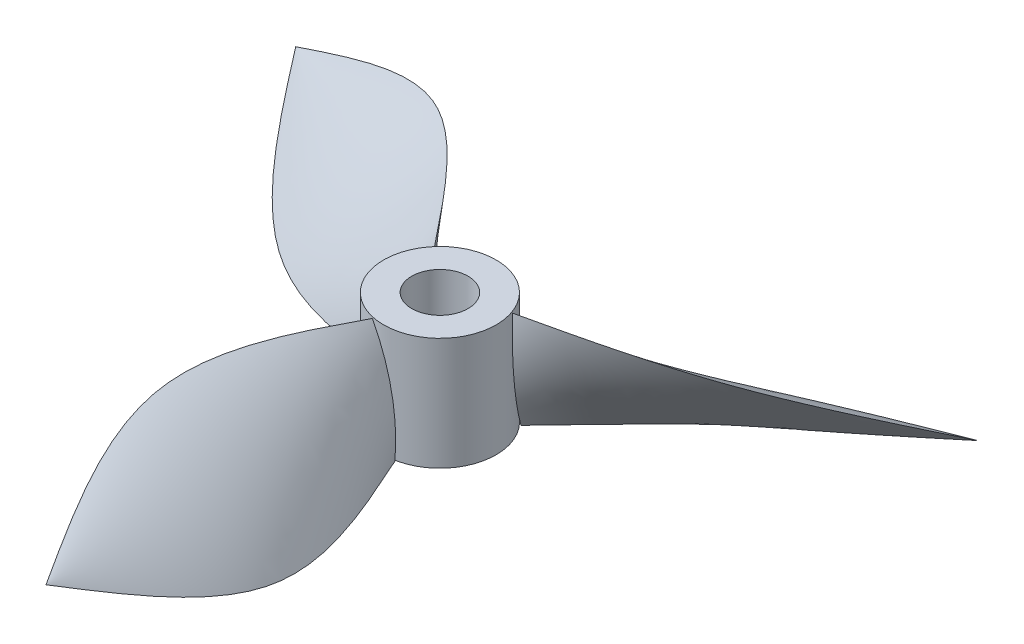
ISO-10303-21;
HEADER;
FILE_DESCRIPTION(('STEP AP214'),'2;1');
FILE_NAME('part.step','',(''),(''),'','','');
FILE_SCHEMA(('AUTOMOTIVE_DESIGN { 1 0 10303 214 1 1 1 1 }'));
ENDSEC;
DATA;
#1=APPLICATION_CONTEXT('core data for automotive mechanical design processes');
#2=APPLICATION_PROTOCOL_DEFINITION('international standard','automotive_design',2000,#1);
#3=PRODUCT_CONTEXT('',#1,'mechanical');
#4=PRODUCT('Part','Part','',(#3));
#5=PRODUCT_RELATED_PRODUCT_CATEGORY('part','',(#4));
#6=PRODUCT_DEFINITION_FORMATION('','',#4);
#7=PRODUCT_DEFINITION_CONTEXT('part definition',#1,'design');
#8=PRODUCT_DEFINITION('design','',#6,#7);
#9=PRODUCT_DEFINITION_SHAPE('','',#8);
#10=(LENGTH_UNIT() NAMED_UNIT(*) SI_UNIT(.MILLI.,.METRE.));
#11=(NAMED_UNIT(*) PLANE_ANGLE_UNIT() SI_UNIT($,.RADIAN.));
#12=(NAMED_UNIT(*) SI_UNIT($,.STERADIAN.) SOLID_ANGLE_UNIT());
#13=UNCERTAINTY_MEASURE_WITH_UNIT(LENGTH_MEASURE(1.E-05),#10,'distance_accuracy_value','');
#14=(GEOMETRIC_REPRESENTATION_CONTEXT(3) GLOBAL_UNCERTAINTY_ASSIGNED_CONTEXT((#13)) GLOBAL_UNIT_ASSIGNED_CONTEXT((#10,
#11,#12)) REPRESENTATION_CONTEXT('',''));
#15=CARTESIAN_POINT('',(0.,0.,0.));
#16=DIRECTION('',(0.,0.,1.));
#17=DIRECTION('',(1.,0.,0.));
#18=AXIS2_PLACEMENT_3D('',#15,#16,#17);
#19=CARTESIAN_POINT('',(8.66025403784443,10.,-4.99999999999992));
#20=DIRECTION('',(-0.866025403784443,0.,0.499999999999992));
#21=DIRECTION('',(0.499999999999992,0.,0.866025403784443));
#22=AXIS2_PLACEMENT_3D('',#19,#20,#21);
#23=PLANE('',#22);
#24=CARTESIAN_POINT('',(7.66025403784445,0.,-6.7320508075688));
#25=CARTESIAN_POINT('',(7.34575721988956,6.91296700891519,-7.27677527508542));
#26=CARTESIAN_POINT('',(8.04053255032547,13.8607203132744,-6.07338910292496));
#27=CARTESIAN_POINT('',(9.66025403784442,20.,-3.26794919243104));
#28=B_SPLINE_CURVE_WITH_KNOTS('',3,(#24,#25,#26,#27),.UNSPECIFIED.,.F.,.F.,(4,4),(0.,1.),.UNSPECIFIED.);
#29=CARTESIAN_POINT('',(7.66025403784445,0.,-6.7320508075688));
#30=VERTEX_POINT('',#29);
#31=CARTESIAN_POINT('',(9.66025403784442,20.,-3.26794919243104));
#32=VERTEX_POINT('',#31);
#33=EDGE_CURVE('E12',#30,#32,#28,.T.);
#34=ORIENTED_EDGE('',*,*,#33,.F.);
#35=CARTESIAN_POINT('',(9.66025403784442,20.,-3.26794919243104));
#36=CARTESIAN_POINT('',(9.97475085579931,13.0870329910848,-2.72322472491442));
#37=CARTESIAN_POINT('',(9.2799755253634,6.13927968672565,-3.92661089707488));
#38=CARTESIAN_POINT('',(7.66025403784445,0.,-6.7320508075688));
#39=B_SPLINE_CURVE_WITH_KNOTS('',3,(#35,#36,#37,#38),.UNSPECIFIED.,.F.,.F.,(4,4),(0.,1.),.UNSPECIFIED.);
#40=EDGE_CURVE('E58',#32,#30,#39,.T.);
#41=ORIENTED_EDGE('',*,*,#40,.F.);
#42=EDGE_LOOP('',(#34,#41));
#43=FACE_BOUND('',#42,.T.);
#44=ADVANCED_FACE('F47',(#43),#23,.T.);
#45=CARTESIAN_POINT('',(7.66025403784445,0.,-6.7320508075688));
#46=CARTESIAN_POINT('',(14.336856526246,-0.790885049230823,-15.3356509891776));
#47=CARTESIAN_POINT('',(27.9261753499969,-2.40062429993598,-32.8471122605457));
#48=CARTESIAN_POINT('',(49.5977298419084,5.81885420147433,-34.2741061007253));
#49=CARTESIAN_POINT('',(60.621778264911,10.,-34.9999999999994));
#50=CARTESIAN_POINT('',(7.34575721988956,6.91296700891519,-7.27677527508542));
#51=CARTESIAN_POINT('',(15.3263328322946,7.37562624414803,-13.6218277542158));
#52=CARTESIAN_POINT('',(31.5697120932917,8.31730636742238,-26.5363215019148));
#53=CARTESIAN_POINT('',(50.8262291478732,9.4326424830003,-32.1462828857311));
#54=CARTESIAN_POINT('',(60.621778264911,10.,-34.9999999999994));
#55=CARTESIAN_POINT('',(8.04053255032547,13.8607203132744,-6.07338910292496));
#56=CARTESIAN_POINT('',(17.440339938458,14.8539731267399,-9.96026003877905));
#57=CARTESIAN_POINT('',(36.5723729898617,16.8756045145931,-17.8714586560174));
#58=CARTESIAN_POINT('',(52.5129873370758,12.3182627126816,-29.2247320019492));
#59=CARTESIAN_POINT('',(60.621778264911,10.,-34.9999999999994));
#60=CARTESIAN_POINT('',(9.66025403784442,20.,-3.26794919243104));
#61=CARTESIAN_POINT('',(20.4494916033228,20.7908850492308,-4.74825646755258));
#62=CARTESIAN_POINT('',(42.4095213335904,22.4006242999359,-7.76122115336251));
#63=CARTESIAN_POINT('',(54.481111496186,14.1811457985257,-25.8158409627666));
#64=CARTESIAN_POINT('',(60.621778264911,10.,-34.9999999999994));
#65=B_SPLINE_SURFACE_WITH_KNOTS('',3,3,((#45,#46,#47,#48,#49),(#50,#51,#52,#53,#54),(#55,#56,
#57,#58,#59),(#60,#61,#62,#63,#64)),.UNSPECIFIED.,.F.,.F.,.F.,(4,4),(4,1,4),(0.,1.),(0.,
0.491312520884595,1.),.UNSPECIFIED.);
#66=CARTESIAN_POINT('',(9.66025403784442,20.,-3.26794919243104));
#67=CARTESIAN_POINT('',(20.4494916033229,20.7908850492309,-4.74825646755256));
#68=CARTESIAN_POINT('',(42.4095213335904,22.400624299936,-7.76122115336245));
#69=CARTESIAN_POINT('',(54.481111496186,14.1811457985257,-25.8158409627666));
#70=CARTESIAN_POINT('',(60.621778264911,10.,-34.9999999999994));
#71=B_SPLINE_CURVE_WITH_KNOTS('',3,(#66,#67,#68,#69,#70),.UNSPECIFIED.,.F.,.F.,(4,1,4),(0.,
0.491312520884595,1.),.UNSPECIFIED.);
#72=CARTESIAN_POINT('',(60.621778264911,10.,-34.9999999999994));
#73=VERTEX_POINT('',#72);
#74=EDGE_CURVE('E77',#73,#32,#71,.F.);
#75=CARTESIAN_POINT('',(7.66025403784445,0.,-6.7320508075688));
#76=CARTESIAN_POINT('',(14.336856526246,-0.790885049230808,-15.3356509891776));
#77=CARTESIAN_POINT('',(27.9261753499969,-2.40062429993596,-32.8471122605456));
#78=CARTESIAN_POINT('',(49.5977298419084,5.81885420147433,-34.2741061007253));
#79=CARTESIAN_POINT('',(60.621778264911,10.,-34.9999999999994));
#80=B_SPLINE_CURVE_WITH_KNOTS('',3,(#75,#76,#77,#78,#79),.UNSPECIFIED.,.F.,.F.,(4,1,4),(0.,
0.491312520884595,1.),.UNSPECIFIED.);
#81=EDGE_CURVE('E66',#30,#73,#80,.T.);
#82=ORIENTED_EDGE('',*,*,#33,.T.);
#83=ORIENTED_EDGE('',*,*,#74,.F.);
#84=ORIENTED_EDGE('',*,*,#81,.F.);
#85=EDGE_LOOP('',(#82,#83,#84));
#86=FACE_BOUND('',#85,.T.);
#87=ADVANCED_FACE('F76',(#86),#65,.T.);
#88=CARTESIAN_POINT('',(9.66025403784442,20.,-3.26794919243104));
#89=CARTESIAN_POINT('',(20.4494916033229,20.7908850492309,-4.74825646755256));
#90=CARTESIAN_POINT('',(42.4095213335904,22.400624299936,-7.76122115336245));
#91=CARTESIAN_POINT('',(54.481111496186,14.1811457985257,-25.8158409627666));
#92=CARTESIAN_POINT('',(60.621778264911,10.,-34.9999999999994));
#93=CARTESIAN_POINT('',(9.97475085579931,13.0870329910848,-2.72322472491442));
#94=CARTESIAN_POINT('',(19.4600152972742,12.624373755852,-6.46207970251437));
#95=CARTESIAN_POINT('',(38.7659845902956,11.6826936325776,-14.0720119119933));
#96=CARTESIAN_POINT('',(53.2526121902212,10.5673575169997,-27.9436641777607));
#97=CARTESIAN_POINT('',(60.621778264911,10.,-34.9999999999994));
#98=CARTESIAN_POINT('',(9.2799755253634,6.13927968672565,-3.92661089707488));
#99=CARTESIAN_POINT('',(17.3460081911108,5.14602687326009,-10.1236474179511));
#100=CARTESIAN_POINT('',(33.7633236937256,3.12439548540691,-22.7368747578907));
#101=CARTESIAN_POINT('',(51.5658540010186,7.68173728731839,-30.8652150615426));
#102=CARTESIAN_POINT('',(60.621778264911,10.,-34.9999999999994));
#103=CARTESIAN_POINT('',(7.66025403784445,0.,-6.7320508075688));
#104=CARTESIAN_POINT('',(14.336856526246,-0.790885049230808,-15.3356509891776));
#105=CARTESIAN_POINT('',(27.9261753499969,-2.40062429993596,-32.8471122605456));
#106=CARTESIAN_POINT('',(49.5977298419084,5.81885420147433,-34.2741061007253));
#107=CARTESIAN_POINT('',(60.621778264911,10.,-34.9999999999994));
#108=B_SPLINE_SURFACE_WITH_KNOTS('',3,3,((#88,#89,#90,#91,#92),(#93,#94,#95,#96,#97),(#98,#99,
#100,#101,#102),(#103,#104,#105,#106,#107)),.UNSPECIFIED.,.F.,.F.,.F.,(4,4),(4,1,4),(0.,1.),(0.,
0.491312520884595,1.),.UNSPECIFIED.);
#109=ORIENTED_EDGE('',*,*,#40,.T.);
#110=ORIENTED_EDGE('',*,*,#81,.T.);
#111=ORIENTED_EDGE('',*,*,#74,.T.);
#112=EDGE_LOOP('',(#109,#110,#111));
#113=FACE_BOUND('',#112,.T.);
#114=ADVANCED_FACE('F79',(#113),#108,.T.);
#115=CLOSED_SHELL('',(#44,#87,#114));
#116=MANIFOLD_SOLID_BREP('B2',#115);
#117=CARTESIAN_POINT('',(-8.66025403784437,10.,-5.00000000000004));
#118=DIRECTION('',(0.866025403784436,0.,0.500000000000004));
#119=DIRECTION('',(0.500000000000004,0.,-0.866025403784436));
#120=AXIS2_PLACEMENT_3D('',#117,#118,#119);
#121=PLANE('',#120);
#122=CARTESIAN_POINT('',(-9.66025403784437,0.,-3.26794919243117));
#123=CARTESIAN_POINT('',(-9.97475085579927,6.91296700891519,-2.72322472491455));
#124=CARTESIAN_POINT('',(-9.27997552536335,13.8607203132744,-3.92661089707501));
#125=CARTESIAN_POINT('',(-7.66025403784436,20.,-6.73205080756891));
#126=B_SPLINE_CURVE_WITH_KNOTS('',3,(#122,#123,#124,#125),.UNSPECIFIED.,.F.,.F.,(4,4),(0.,1.),.UNSPECIFIED.);
#127=CARTESIAN_POINT('',(-9.66025403784437,0.,-3.26794919243117));
#128=VERTEX_POINT('',#127);
#129=CARTESIAN_POINT('',(-7.66025403784436,20.,-6.73205080756891));
#130=VERTEX_POINT('',#129);
#131=EDGE_CURVE('E45',#128,#130,#126,.T.);
#132=ORIENTED_EDGE('',*,*,#131,.F.);
#133=CARTESIAN_POINT('',(-7.66025403784436,20.,-6.73205080756891));
#134=CARTESIAN_POINT('',(-7.34575721988946,13.0870329910848,-7.27677527508553));
#135=CARTESIAN_POINT('',(-8.04053255032538,6.13927968672565,-6.07338910292507));
#136=CARTESIAN_POINT('',(-9.66025403784437,0.,-3.26794919243117));
#137=B_SPLINE_CURVE_WITH_KNOTS('',3,(#133,#134,#135,#136),.UNSPECIFIED.,.F.,.F.,(4,4),(0.,1.),.UNSPECIFIED.);
#138=EDGE_CURVE('E185',#130,#128,#137,.T.);
#139=ORIENTED_EDGE('',*,*,#138,.F.);
#140=EDGE_LOOP('',(#132,#139));
#141=FACE_BOUND('',#140,.T.);
#142=ADVANCED_FACE('F174',(#141),#121,.T.);
#143=CARTESIAN_POINT('',(-9.66025403784437,0.,-3.26794919243117));
#144=CARTESIAN_POINT('',(-20.4494916033228,-0.790885049230823,-4.74825646755285));
#145=CARTESIAN_POINT('',(-42.4095213335903,-2.40062429993598,-7.76122115336306));
#146=CARTESIAN_POINT('',(-54.4811114961856,5.81885420147433,-25.8158409627674));
#147=CARTESIAN_POINT('',(-60.6217782649106,10.,-35.0000000000003));
#148=CARTESIAN_POINT('',(-9.97475085579927,6.91296700891519,-2.72322472491455));
#149=CARTESIAN_POINT('',(-19.4600152972741,7.37562624414803,-6.46207970251465));
#150=CARTESIAN_POINT('',(-38.7659845902954,8.31730636742238,-14.0720119119938));
#151=CARTESIAN_POINT('',(-53.2526121902208,9.4326424830003,-27.9436641777615));
#152=CARTESIAN_POINT('',(-60.6217782649106,10.,-35.0000000000003));
#153=CARTESIAN_POINT('',(-9.27997552536335,13.8607203132744,-3.92661089707501));
#154=CARTESIAN_POINT('',(-17.3460081911107,14.8539731267399,-10.1236474179514));
#155=CARTESIAN_POINT('',(-33.7633236937253,16.8756045145931,-22.7368747578912));
#156=CARTESIAN_POINT('',(-51.5658540010182,12.3182627126816,-30.8652150615433));
#157=CARTESIAN_POINT('',(-60.6217782649106,10.,-35.0000000000003));
#158=CARTESIAN_POINT('',(-7.66025403784436,20.,-6.73205080756891));
#159=CARTESIAN_POINT('',(-14.3368565262458,20.7908850492308,-15.3356509891778));
#160=CARTESIAN_POINT('',(-27.9261753499965,22.4006242999359,-32.847112260546));
#161=CARTESIAN_POINT('',(-49.597729841908,14.1811457985257,-34.2741061007259));
#162=CARTESIAN_POINT('',(-60.6217782649106,10.,-35.0000000000003));
#163=B_SPLINE_SURFACE_WITH_KNOTS('',3,3,((#143,#144,#145,#146,#147),(#148,#149,#150,#151,#152),
(#153,#154,#155,#156,#157),(#158,#159,#160,#161,#162)),.UNSPECIFIED.,.F.,.F.,.F.,(4,4),(4,1,4),
(0.,1.),(0.,0.491312520884595,1.),.UNSPECIFIED.);
#164=CARTESIAN_POINT('',(-7.66025403784436,20.,-6.73205080756891));
#165=CARTESIAN_POINT('',(-14.3368565262458,20.7908850492309,-15.3356509891778));
#166=CARTESIAN_POINT('',(-27.9261753499964,22.400624299936,-32.8471122605461));
#167=CARTESIAN_POINT('',(-49.5977298419079,14.1811457985257,-34.274106100726));
#168=CARTESIAN_POINT('',(-60.6217782649106,10.,-35.0000000000003));
#169=B_SPLINE_CURVE_WITH_KNOTS('',3,(#164,#165,#166,#167,#168),.UNSPECIFIED.,.F.,.F.,(4,1,4),
(0.,0.491312520884595,1.),.UNSPECIFIED.);
#170=CARTESIAN_POINT('',(-60.6217782649106,10.,-35.0000000000003));
#171=VERTEX_POINT('',#170);
#172=EDGE_CURVE('E204',#171,#130,#169,.F.);
#173=CARTESIAN_POINT('',(-9.66025403784437,0.,-3.26794919243117));
#174=CARTESIAN_POINT('',(-20.4494916033228,-0.790885049230808,-4.74825646755287));
#175=CARTESIAN_POINT('',(-42.4095213335903,-2.40062429993596,-7.7612211533631));
#176=CARTESIAN_POINT('',(-54.4811114961856,5.81885420147433,-25.8158409627674));
#177=CARTESIAN_POINT('',(-60.6217782649106,10.,-35.0000000000003));
#178=B_SPLINE_CURVE_WITH_KNOTS('',3,(#173,#174,#175,#176,#177),.UNSPECIFIED.,.F.,.F.,(4,1,4),
(0.,0.491312520884595,1.),.UNSPECIFIED.);
#179=EDGE_CURVE('E193',#128,#171,#178,.T.);
#180=ORIENTED_EDGE('',*,*,#131,.T.);
#181=ORIENTED_EDGE('',*,*,#172,.F.);
#182=ORIENTED_EDGE('',*,*,#179,.F.);
#183=EDGE_LOOP('',(#180,#181,#182));
#184=FACE_BOUND('',#183,.T.);
#185=ADVANCED_FACE('F203',(#184),#163,.T.);
#186=CARTESIAN_POINT('',(-7.66025403784436,20.,-6.73205080756891));
#187=CARTESIAN_POINT('',(-14.3368565262458,20.7908850492309,-15.3356509891778));
#188=CARTESIAN_POINT('',(-27.9261753499964,22.400624299936,-32.8471122605461));
#189=CARTESIAN_POINT('',(-49.5977298419079,14.1811457985257,-34.274106100726));
#190=CARTESIAN_POINT('',(-60.6217782649106,10.,-35.0000000000003));
#191=CARTESIAN_POINT('',(-7.34575721988946,13.0870329910848,-7.27677527508553));
#192=CARTESIAN_POINT('',(-15.3263328322944,12.624373755852,-13.621827754216));
#193=CARTESIAN_POINT('',(-31.5697120932913,11.6826936325776,-26.5363215019153));
#194=CARTESIAN_POINT('',(-50.8262291478727,10.5673575169997,-32.1462828857319));
#195=CARTESIAN_POINT('',(-60.6217782649106,10.,-35.0000000000003));
#196=CARTESIAN_POINT('',(-8.04053255032538,6.13927968672565,-6.07338910292507));
#197=CARTESIAN_POINT('',(-17.4403399384579,5.14602687326009,-9.9602600387793));
#198=CARTESIAN_POINT('',(-36.5723729898614,3.12439548540691,-17.8714586560179));
#199=CARTESIAN_POINT('',(-52.5129873370754,7.68173728731839,-29.22473200195));
#200=CARTESIAN_POINT('',(-60.6217782649106,10.,-35.0000000000003));
#201=CARTESIAN_POINT('',(-9.66025403784437,0.,-3.26794919243117));
#202=CARTESIAN_POINT('',(-20.4494916033228,-0.790885049230808,-4.74825646755287));
#203=CARTESIAN_POINT('',(-42.4095213335903,-2.40062429993596,-7.7612211533631));
#204=CARTESIAN_POINT('',(-54.4811114961856,5.81885420147433,-25.8158409627674));
#205=CARTESIAN_POINT('',(-60.6217782649106,10.,-35.0000000000003));
#206=B_SPLINE_SURFACE_WITH_KNOTS('',3,3,((#186,#187,#188,#189,#190),(#191,#192,#193,#194,#195),
(#196,#197,#198,#199,#200),(#201,#202,#203,#204,#205)),.UNSPECIFIED.,.F.,.F.,.F.,(4,4),(4,1,4),
(0.,1.),(0.,0.491312520884595,1.),.UNSPECIFIED.);
#207=ORIENTED_EDGE('',*,*,#138,.T.);
#208=ORIENTED_EDGE('',*,*,#179,.T.);
#209=ORIENTED_EDGE('',*,*,#172,.T.);
#210=EDGE_LOOP('',(#207,#208,#209));
#211=FACE_BOUND('',#210,.T.);
#212=ADVANCED_FACE('F206',(#211),#206,.T.);
#213=CLOSED_SHELL('',(#142,#185,#212));
#214=MANIFOLD_SOLID_BREP('B6',#213);
#215=CARTESIAN_POINT('',(0.,10.,10.));
#216=DIRECTION('',(0.,0.,-1.));
#217=DIRECTION('',(-1.,0.,0.));
#218=AXIS2_PLACEMENT_3D('',#215,#216,#217);
#219=PLANE('',#218);
#220=CARTESIAN_POINT('',(1.99999999999999,0.,10.));
#221=CARTESIAN_POINT('',(2.62899363590979,6.91296700891519,10.));
#222=CARTESIAN_POINT('',(1.23944297503795,13.8607203132744,10.));
#223=CARTESIAN_POINT('',(-1.99999999999999,20.,10.));
#224=B_SPLINE_CURVE_WITH_KNOTS('',3,(#220,#221,#222,#223),.UNSPECIFIED.,.F.,.F.,(4,4),(0.,1.),.UNSPECIFIED.);
#225=CARTESIAN_POINT('',(1.99999999999999,0.,10.));
#226=VERTEX_POINT('',#225);
#227=CARTESIAN_POINT('',(-1.99999999999999,20.,10.));
#228=VERTEX_POINT('',#227);
#229=EDGE_CURVE('E172',#226,#228,#224,.T.);
#230=ORIENTED_EDGE('',*,*,#229,.F.);
#231=CARTESIAN_POINT('',(-1.99999999999999,20.,10.));
#232=CARTESIAN_POINT('',(-2.62899363590979,13.0870329910848,10.));
#233=CARTESIAN_POINT('',(-1.23944297503795,6.13927968672565,10.));
#234=CARTESIAN_POINT('',(1.99999999999999,0.,10.));
#235=B_SPLINE_CURVE_WITH_KNOTS('',3,(#231,#232,#233,#234),.UNSPECIFIED.,.F.,.F.,(4,4),(0.,1.),.UNSPECIFIED.);
#236=EDGE_CURVE('E309',#228,#226,#235,.T.);
#237=ORIENTED_EDGE('',*,*,#236,.F.);
#238=EDGE_LOOP('',(#230,#237));
#239=FACE_BOUND('',#238,.T.);
#240=ADVANCED_FACE('F298',(#239),#219,.T.);
#241=CARTESIAN_POINT('',(1.99999999999999,0.,10.));
#242=CARTESIAN_POINT('',(6.11263507707695,-0.790885049230823,20.0839074567305));
#243=CARTESIAN_POINT('',(14.4833459835938,-2.40062429993598,40.6083334139088));
#244=CARTESIAN_POINT('',(4.88338165427764,5.81885420147433,60.0899470634928));
#245=CARTESIAN_POINT('',(0.,10.,70.));
#246=CARTESIAN_POINT('',(2.62899363590979,6.91296700891519,10.));
#247=CARTESIAN_POINT('',(4.13368246497969,7.37562624414803,20.0839074567305));
#248=CARTESIAN_POINT('',(7.196272497004,8.31730636742238,40.6083334139088));
#249=CARTESIAN_POINT('',(2.42638304234807,9.4326424830003,60.0899470634928));
#250=CARTESIAN_POINT('',(0.,10.,70.));
#251=CARTESIAN_POINT('',(1.23944297503795,13.8607203132744,10.));
#252=CARTESIAN_POINT('',(-0.0943317473471829,14.8539731267399,20.0839074567305));
#253=CARTESIAN_POINT('',(-2.80904929613611,16.8756045145931,40.6083334139088));
#254=CARTESIAN_POINT('',(-0.947133336057252,12.3182627126816,60.0899470634928));
#255=CARTESIAN_POINT('',(0.,10.,70.));
#256=CARTESIAN_POINT('',(-1.99999999999999,20.,10.));
#257=CARTESIAN_POINT('',(-6.11263507707694,20.7908850492308,20.0839074567305));
#258=CARTESIAN_POINT('',(-14.4833459835937,22.4006242999359,40.6083334139088));
#259=CARTESIAN_POINT('',(-4.88338165427762,14.1811457985257,60.0899470634928));
#260=CARTESIAN_POINT('',(0.,10.,70.));
#261=B_SPLINE_SURFACE_WITH_KNOTS('',3,3,((#241,#242,#243,#244,#245),(#246,#247,#248,#249,#250),
(#251,#252,#253,#254,#255),(#256,#257,#258,#259,#260)),.UNSPECIFIED.,.F.,.F.,.F.,(4,4),(4,1,4),
(0.,1.),(0.,0.491312520884595,1.),.UNSPECIFIED.);
#262=CARTESIAN_POINT('',(-1.99999999999999,20.,10.));
#263=CARTESIAN_POINT('',(-6.11263507707696,20.7908850492309,20.0839074567305));
#264=CARTESIAN_POINT('',(-14.4833459835938,22.400624299936,40.6083334139088));
#265=CARTESIAN_POINT('',(-4.88338165427764,14.1811457985257,60.0899470634928));
#266=CARTESIAN_POINT('',(0.,10.,70.));
#267=B_SPLINE_CURVE_WITH_KNOTS('',3,(#262,#263,#264,#265,#266),.UNSPECIFIED.,.F.,.F.,(4,1,4),
(0.,0.491312520884595,1.),.UNSPECIFIED.);
#268=CARTESIAN_POINT('',(0.,10.,70.));
#269=VERTEX_POINT('',#268);
#270=EDGE_CURVE('E328',#269,#228,#267,.F.);
#271=CARTESIAN_POINT('',(1.99999999999999,0.,10.));
#272=CARTESIAN_POINT('',(6.11263507707694,-0.790885049230808,20.0839074567305));
#273=CARTESIAN_POINT('',(14.4833459835937,-2.40062429993596,40.6083334139088));
#274=CARTESIAN_POINT('',(4.88338165427762,5.81885420147433,60.0899470634928));
#275=CARTESIAN_POINT('',(0.,10.,70.));
#276=B_SPLINE_CURVE_WITH_KNOTS('',3,(#271,#272,#273,#274,#275),.UNSPECIFIED.,.F.,.F.,(4,1,4),
(0.,0.491312520884595,1.),.UNSPECIFIED.);
#277=EDGE_CURVE('E317',#226,#269,#276,.T.);
#278=ORIENTED_EDGE('',*,*,#229,.T.);
#279=ORIENTED_EDGE('',*,*,#270,.F.);
#280=ORIENTED_EDGE('',*,*,#277,.F.);
#281=EDGE_LOOP('',(#278,#279,#280));
#282=FACE_BOUND('',#281,.T.);
#283=ADVANCED_FACE('F327',(#282),#261,.T.);
#284=CARTESIAN_POINT('',(-1.99999999999999,20.,10.));
#285=CARTESIAN_POINT('',(-6.11263507707696,20.7908850492309,20.0839074567305));
#286=CARTESIAN_POINT('',(-14.4833459835938,22.400624299936,40.6083334139088));
#287=CARTESIAN_POINT('',(-4.88338165427764,14.1811457985257,60.0899470634928));
#288=CARTESIAN_POINT('',(0.,10.,70.));
#289=CARTESIAN_POINT('',(-2.62899363590979,13.0870329910848,10.));
#290=CARTESIAN_POINT('',(-4.1336824649797,12.624373755852,20.0839074567305));
#291=CARTESIAN_POINT('',(-7.19627249700403,11.6826936325776,40.6083334139088));
#292=CARTESIAN_POINT('',(-2.42638304234809,10.5673575169997,60.0899470634928));
#293=CARTESIAN_POINT('',(0.,10.,70.));
#294=CARTESIAN_POINT('',(-1.23944297503795,6.13927968672565,10.));
#295=CARTESIAN_POINT('',(0.0943317473471794,5.14602687326009,20.0839074567305));
#296=CARTESIAN_POINT('',(2.8090492961361,3.12439548540691,40.6083334139088));
#297=CARTESIAN_POINT('',(0.947133336057248,7.68173728731839,60.0899470634928));
#298=CARTESIAN_POINT('',(0.,10.,70.));
#299=CARTESIAN_POINT('',(1.99999999999999,0.,10.));
#300=CARTESIAN_POINT('',(6.11263507707694,-0.790885049230808,20.0839074567305));
#301=CARTESIAN_POINT('',(14.4833459835937,-2.40062429993596,40.6083334139088));
#302=CARTESIAN_POINT('',(4.88338165427762,5.81885420147433,60.0899470634928));
#303=CARTESIAN_POINT('',(0.,10.,70.));
#304=B_SPLINE_SURFACE_WITH_KNOTS('',3,3,((#284,#285,#286,#287,#288),(#289,#290,#291,#292,#293),
(#294,#295,#296,#297,#298),(#299,#300,#301,#302,#303)),.UNSPECIFIED.,.F.,.F.,.F.,(4,4),(4,1,4),
(0.,1.),(0.,0.491312520884595,1.),.UNSPECIFIED.);
#305=ORIENTED_EDGE('',*,*,#236,.T.);
#306=ORIENTED_EDGE('',*,*,#277,.T.);
#307=ORIENTED_EDGE('',*,*,#270,.T.);
#308=EDGE_LOOP('',(#305,#306,#307));
#309=FACE_BOUND('',#308,.T.);
#310=ADVANCED_FACE('F330',(#309),#304,.T.);
#311=CLOSED_SHELL('',(#240,#283,#310));
#312=MANIFOLD_SOLID_BREP('B39',#311);
#313=CARTESIAN_POINT('',(0.,20.,0.));
#314=DIRECTION('',(0.,1.,0.));
#315=DIRECTION('',(0.,0.,1.));
#316=AXIS2_PLACEMENT_3D('',#313,#314,#315);
#317=PLANE('',#316);
#318=CARTESIAN_POINT('',(0.,20.,0.));
#319=DIRECTION('',(0.,1.,0.));
#320=DIRECTION('',(0.,0.,1.));
#321=AXIS2_PLACEMENT_3D('',#318,#319,#320);
#322=CIRCLE('',#321,10.);
#323=CARTESIAN_POINT('',(0.,20.,10.));
#324=VERTEX_POINT('',#323);
#325=EDGE_CURVE('E297',#324,#324,#322,.T.);
#326=ORIENTED_EDGE('',*,*,#325,.T.);
#327=EDGE_LOOP('',(#326));
#328=FACE_BOUND('',#327,.T.);
#329=CARTESIAN_POINT('',(0.,20.,0.));
#330=DIRECTION('',(0.,1.,0.));
#331=DIRECTION('',(0.,0.,1.));
#332=AXIS2_PLACEMENT_3D('',#329,#330,#331);
#333=CIRCLE('',#332,5.);
#334=CARTESIAN_POINT('',(0.,20.,5.));
#335=VERTEX_POINT('',#334);
#336=EDGE_CURVE('E426',#335,#335,#333,.T.);
#337=ORIENTED_EDGE('',*,*,#336,.F.);
#338=EDGE_LOOP('',(#337));
#339=FACE_BOUND('',#338,.T.);
#340=ADVANCED_FACE('F415',(#328,#339),#317,.T.);
#341=CARTESIAN_POINT('',(0.,0.,0.));
#342=DIRECTION('',(0.,1.,0.));
#343=DIRECTION('',(0.,0.,1.));
#344=AXIS2_PLACEMENT_3D('',#341,#342,#343);
#345=PLANE('',#344);
#346=CARTESIAN_POINT('',(0.,0.,0.));
#347=DIRECTION('',(0.,1.,0.));
#348=DIRECTION('',(0.,0.,1.));
#349=AXIS2_PLACEMENT_3D('',#346,#347,#348);
#350=CIRCLE('',#349,10.);
#351=CARTESIAN_POINT('',(0.,0.,10.));
#352=VERTEX_POINT('',#351);
#353=EDGE_CURVE('E419',#352,#352,#350,.T.);
#354=ORIENTED_EDGE('',*,*,#353,.F.);
#355=EDGE_LOOP('',(#354));
#356=FACE_BOUND('',#355,.T.);
#357=CARTESIAN_POINT('',(0.,0.,0.));
#358=DIRECTION('',(0.,1.,0.));
#359=DIRECTION('',(0.,0.,1.));
#360=AXIS2_PLACEMENT_3D('',#357,#358,#359);
#361=CIRCLE('',#360,5.);
#362=CARTESIAN_POINT('',(0.,0.,5.));
#363=VERTEX_POINT('',#362);
#364=EDGE_CURVE('E428',#363,#363,#361,.T.);
#365=ORIENTED_EDGE('',*,*,#364,.T.);
#366=EDGE_LOOP('',(#365));
#367=FACE_BOUND('',#366,.T.);
#368=ADVANCED_FACE('F438',(#356,#367),#345,.F.);
#369=CARTESIAN_POINT('',(0.,20.,0.));
#370=DIRECTION('',(0.,-1.,0.));
#371=DIRECTION('',(0.,0.,-1.));
#372=AXIS2_PLACEMENT_3D('',#369,#370,#371);
#373=CYLINDRICAL_SURFACE('',#372,10.);
#374=ORIENTED_EDGE('',*,*,#325,.F.);
#375=EDGE_LOOP('',(#374));
#376=FACE_BOUND('',#375,.T.);
#377=ORIENTED_EDGE('',*,*,#353,.T.);
#378=EDGE_LOOP('',(#377));
#379=FACE_BOUND('',#378,.T.);
#380=ADVANCED_FACE('F417',(#376,#379),#373,.T.);
#381=CARTESIAN_POINT('',(0.,20.,0.));
#382=DIRECTION('',(0.,-1.,0.));
#383=DIRECTION('',(0.,0.,-1.));
#384=AXIS2_PLACEMENT_3D('',#381,#382,#383);
#385=CYLINDRICAL_SURFACE('',#384,5.);
#386=ORIENTED_EDGE('',*,*,#336,.T.);
#387=EDGE_LOOP('',(#386));
#388=FACE_BOUND('',#387,.T.);
#389=ORIENTED_EDGE('',*,*,#364,.F.);
#390=EDGE_LOOP('',(#389));
#391=FACE_BOUND('',#390,.T.);
#392=ADVANCED_FACE('F434',(#388,#391),#385,.F.);
#393=CLOSED_SHELL('',(#340,#368,#380,#392));
#394=MANIFOLD_SOLID_BREP('B166',#393);
#395=ADVANCED_BREP_SHAPE_REPRESENTATION('',(#18,#116,#214,#312,#394),#14);
#396=SHAPE_DEFINITION_REPRESENTATION(#9,#395);
ENDSEC;
END-ISO-10303-21;
